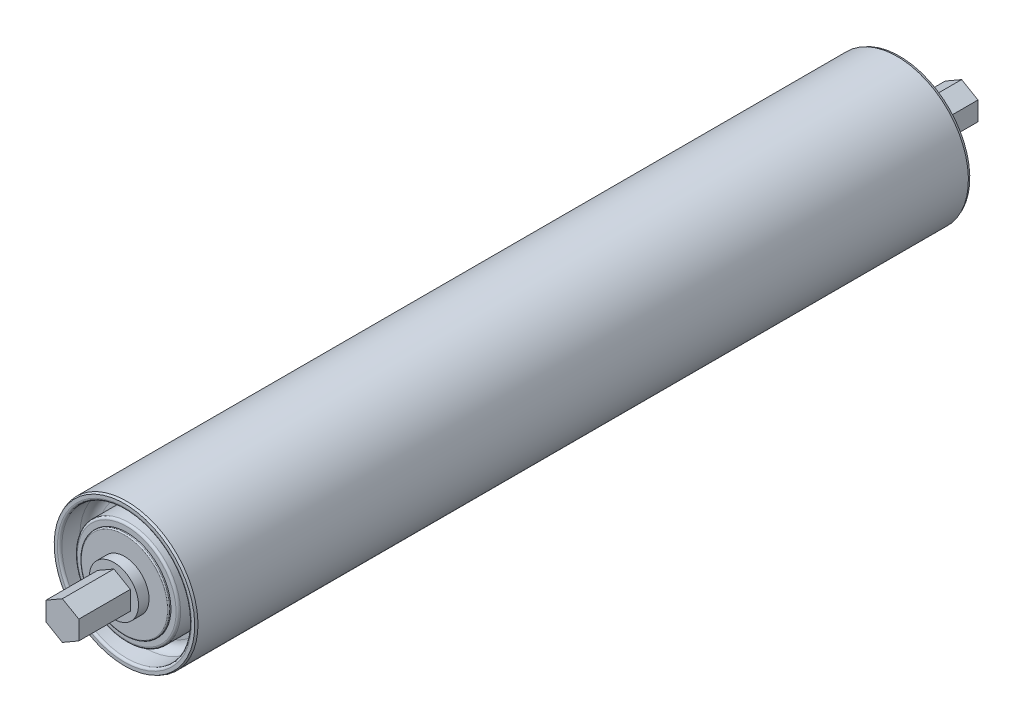
ISO-10303-21;
HEADER;
FILE_DESCRIPTION(('STEP AP214'),'2;1');
FILE_NAME('part.step','',(''),(''),'','','');
FILE_SCHEMA(('AUTOMOTIVE_DESIGN { 1 0 10303 214 1 1 1 1 }'));
ENDSEC;
DATA;
#1=APPLICATION_CONTEXT('core data for automotive mechanical design processes');
#2=APPLICATION_PROTOCOL_DEFINITION('international standard','automotive_design',2000,#1);
#3=PRODUCT_CONTEXT('',#1,'mechanical');
#4=PRODUCT('Part','Part','',(#3));
#5=PRODUCT_RELATED_PRODUCT_CATEGORY('part','',(#4));
#6=PRODUCT_DEFINITION_FORMATION('','',#4);
#7=PRODUCT_DEFINITION_CONTEXT('part definition',#1,'design');
#8=PRODUCT_DEFINITION('design','',#6,#7);
#9=PRODUCT_DEFINITION_SHAPE('','',#8);
#10=(LENGTH_UNIT() NAMED_UNIT(*) SI_UNIT(.MILLI.,.METRE.));
#11=(NAMED_UNIT(*) PLANE_ANGLE_UNIT() SI_UNIT($,.RADIAN.));
#12=(NAMED_UNIT(*) SI_UNIT($,.STERADIAN.) SOLID_ANGLE_UNIT());
#13=UNCERTAINTY_MEASURE_WITH_UNIT(LENGTH_MEASURE(1.E-05),#10,'distance_accuracy_value','');
#14=(GEOMETRIC_REPRESENTATION_CONTEXT(3) GLOBAL_UNCERTAINTY_ASSIGNED_CONTEXT((#13)) GLOBAL_UNIT_ASSIGNED_CONTEXT((#10,
#11,#12)) REPRESENTATION_CONTEXT('',''));
#15=CARTESIAN_POINT('',(0.,0.,0.));
#16=DIRECTION('',(0.,0.,1.));
#17=DIRECTION('',(1.,0.,0.));
#18=AXIS2_PLACEMENT_3D('',#15,#16,#17);
#19=CARTESIAN_POINT('',(0.,23.8125,-131.365625));
#20=DIRECTION('',(0.,0.,1.));
#21=DIRECTION('',(0.,-1.,0.));
#22=AXIS2_PLACEMENT_3D('',#19,#20,#21);
#23=PLANE('',#22);
#24=CARTESIAN_POINT('',(0.,0.,-131.365625));
#25=DIRECTION('',(0.,0.,1.));
#26=DIRECTION('',(0.,-1.,0.));
#27=AXIS2_PLACEMENT_3D('',#24,#25,#26);
#28=CIRCLE('',#27,22.733);
#29=CARTESIAN_POINT('',(0.,-22.733,-131.365625));
#30=VERTEX_POINT('',#29);
#31=EDGE_CURVE('E296',#30,#30,#28,.T.);
#32=ORIENTED_EDGE('',*,*,#31,.T.);
#33=EDGE_LOOP('',(#32));
#34=FACE_BOUND('',#33,.T.);
#35=CARTESIAN_POINT('',(0.,0.,-131.365625));
#36=DIRECTION('',(0.,0.,1.));
#37=DIRECTION('',(0.,-1.,0.));
#38=AXIS2_PLACEMENT_3D('',#35,#36,#37);
#39=CIRCLE('',#38,23.8125);
#40=CARTESIAN_POINT('',(0.,-23.8125,-131.365625));
#41=VERTEX_POINT('',#40);
#42=EDGE_CURVE('E214',#41,#41,#39,.T.);
#43=ORIENTED_EDGE('',*,*,#42,.F.);
#44=EDGE_LOOP('',(#43));
#45=FACE_BOUND('',#44,.T.);
#46=ADVANCED_FACE('F32',(#34,#45),#23,.F.);
#47=CARTESIAN_POINT('',(0.,0.,-131.365625));
#48=DIRECTION('',(0.,0.,1.));
#49=DIRECTION('',(0.,-1.,0.));
#50=AXIS2_PLACEMENT_3D('',#47,#48,#49);
#51=CONICAL_SURFACE('',#50,23.8125,0.380506377112347);
#52=CARTESIAN_POINT('',(0.,0.,-130.571875));
#53=DIRECTION('',(0.,0.,1.));
#54=DIRECTION('',(0.,-1.,0.));
#55=AXIS2_PLACEMENT_3D('',#52,#53,#54);
#56=CIRCLE('',#55,24.13);
#57=CARTESIAN_POINT('',(0.,-24.13,-130.571875));
#58=VERTEX_POINT('',#57);
#59=EDGE_CURVE('E211',#58,#58,#56,.T.);
#60=ORIENTED_EDGE('',*,*,#59,.F.);
#61=EDGE_LOOP('',(#60));
#62=FACE_BOUND('',#61,.T.);
#63=ORIENTED_EDGE('',*,*,#42,.T.);
#64=EDGE_LOOP('',(#63));
#65=FACE_BOUND('',#64,.T.);
#66=ADVANCED_FACE('F382',(#62,#65),#51,.T.);
#67=CARTESIAN_POINT('',(0.,0.,152.4));
#68=DIRECTION('',(0.,0.,1.));
#69=DIRECTION('',(0.,-1.,0.));
#70=AXIS2_PLACEMENT_3D('',#67,#68,#69);
#71=CYLINDRICAL_SURFACE('',#70,24.13);
#72=CARTESIAN_POINT('',(0.,0.,130.571875));
#73=DIRECTION('',(0.,0.,1.));
#74=DIRECTION('',(0.,-1.,0.));
#75=AXIS2_PLACEMENT_3D('',#72,#73,#74);
#76=CIRCLE('',#75,24.13);
#77=CARTESIAN_POINT('',(0.,-24.13,130.571875));
#78=VERTEX_POINT('',#77);
#79=EDGE_CURVE('E208',#78,#78,#76,.T.);
#80=ORIENTED_EDGE('',*,*,#79,.F.);
#81=EDGE_LOOP('',(#80));
#82=FACE_BOUND('',#81,.T.);
#83=ORIENTED_EDGE('',*,*,#59,.T.);
#84=EDGE_LOOP('',(#83));
#85=FACE_BOUND('',#84,.T.);
#86=ADVANCED_FACE('F387',(#82,#85),#71,.T.);
#87=CARTESIAN_POINT('',(0.,0.,130.571875));
#88=DIRECTION('',(0.,0.,-1.));
#89=DIRECTION('',(0.,1.,0.));
#90=AXIS2_PLACEMENT_3D('',#87,#88,#89);
#91=CONICAL_SURFACE('',#90,24.13,0.380506377112371);
#92=CARTESIAN_POINT('',(0.,0.,131.365625));
#93=DIRECTION('',(0.,0.,1.));
#94=DIRECTION('',(0.,-1.,0.));
#95=AXIS2_PLACEMENT_3D('',#92,#93,#94);
#96=CIRCLE('',#95,23.8125);
#97=CARTESIAN_POINT('',(0.,-23.8125,131.365625));
#98=VERTEX_POINT('',#97);
#99=EDGE_CURVE('E205',#98,#98,#96,.T.);
#100=ORIENTED_EDGE('',*,*,#99,.F.);
#101=EDGE_LOOP('',(#100));
#102=FACE_BOUND('',#101,.T.);
#103=ORIENTED_EDGE('',*,*,#79,.T.);
#104=EDGE_LOOP('',(#103));
#105=FACE_BOUND('',#104,.T.);
#106=ADVANCED_FACE('F466',(#102,#105),#91,.T.);
#107=CARTESIAN_POINT('',(0.,23.8125,131.365625));
#108=DIRECTION('',(0.,0.,-1.));
#109=DIRECTION('',(0.,1.,0.));
#110=AXIS2_PLACEMENT_3D('',#107,#108,#109);
#111=PLANE('',#110);
#112=CARTESIAN_POINT('',(0.,0.,131.365625));
#113=DIRECTION('',(0.,0.,1.));
#114=DIRECTION('',(0.,-1.,0.));
#115=AXIS2_PLACEMENT_3D('',#112,#113,#114);
#116=CIRCLE('',#115,22.733);
#117=CARTESIAN_POINT('',(0.,-22.733,131.365625));
#118=VERTEX_POINT('',#117);
#119=EDGE_CURVE('E131',#118,#118,#116,.T.);
#120=ORIENTED_EDGE('',*,*,#119,.F.);
#121=EDGE_LOOP('',(#120));
#122=FACE_BOUND('',#121,.T.);
#123=ORIENTED_EDGE('',*,*,#99,.T.);
#124=EDGE_LOOP('',(#123));
#125=FACE_BOUND('',#124,.T.);
#126=ADVANCED_FACE('F403',(#122,#125),#111,.F.);
#127=CARTESIAN_POINT('',(0.,0.,130.603625));
#128=DIRECTION('',(0.,0.,1.));
#129=DIRECTION('',(0.,-1.,0.));
#130=AXIS2_PLACEMENT_3D('',#127,#128,#129);
#131=TOROIDAL_SURFACE('',#130,22.733,0.762000000000009);
#132=ORIENTED_EDGE('',*,*,#119,.T.);
#133=EDGE_LOOP('',(#132));
#134=FACE_BOUND('',#133,.T.);
#135=CARTESIAN_POINT('',(0.,0.,130.603625));
#136=DIRECTION('',(0.,0.,1.));
#137=DIRECTION('',(0.,-1.,0.));
#138=AXIS2_PLACEMENT_3D('',#135,#136,#137);
#139=CIRCLE('',#138,21.971);
#140=CARTESIAN_POINT('',(0.,-21.971,130.603625));
#141=VERTEX_POINT('',#140);
#142=EDGE_CURVE('E293',#141,#141,#139,.T.);
#143=ORIENTED_EDGE('',*,*,#142,.F.);
#144=EDGE_LOOP('',(#143));
#145=FACE_BOUND('',#144,.T.);
#146=ADVANCED_FACE('F436',(#134,#145),#131,.T.);
#147=CARTESIAN_POINT('',(0.,0.,130.984625));
#148=DIRECTION('',(0.,0.,1.));
#149=DIRECTION('',(0.,-1.,0.));
#150=AXIS2_PLACEMENT_3D('',#147,#148,#149);
#151=TOROIDAL_SURFACE('',#150,14.620875,0.380999999999994);
#152=CARTESIAN_POINT('',(0.,0.,130.984625));
#153=DIRECTION('',(0.,0.,1.));
#154=DIRECTION('',(0.,-1.,0.));
#155=AXIS2_PLACEMENT_3D('',#152,#153,#154);
#156=CIRCLE('',#155,15.001875);
#157=CARTESIAN_POINT('',(0.,-15.001875,130.984625));
#158=VERTEX_POINT('',#157);
#159=EDGE_CURVE('E272',#158,#158,#156,.T.);
#160=ORIENTED_EDGE('',*,*,#159,.T.);
#161=EDGE_LOOP('',(#160));
#162=FACE_BOUND('',#161,.T.);
#163=CARTESIAN_POINT('',(0.,0.,131.365625));
#164=DIRECTION('',(0.,0.,1.));
#165=DIRECTION('',(0.,-1.,0.));
#166=AXIS2_PLACEMENT_3D('',#163,#164,#165);
#167=CIRCLE('',#166,14.620875);
#168=CARTESIAN_POINT('',(0.,-14.620875,131.365625));
#169=VERTEX_POINT('',#168);
#170=EDGE_CURVE('E269',#169,#169,#167,.T.);
#171=ORIENTED_EDGE('',*,*,#170,.F.);
#172=EDGE_LOOP('',(#171));
#173=FACE_BOUND('',#172,.T.);
#174=ADVANCED_FACE('F432',(#162,#173),#151,.T.);
#175=CARTESIAN_POINT('',(0.,0.,152.4));
#176=DIRECTION('',(0.,0.,1.));
#177=DIRECTION('',(0.,-1.,0.));
#178=AXIS2_PLACEMENT_3D('',#175,#176,#177);
#179=CYLINDRICAL_SURFACE('',#178,15.001875);
#180=CARTESIAN_POINT('',(0.,0.,130.603625));
#181=DIRECTION('',(0.,0.,1.));
#182=DIRECTION('',(0.,-1.,0.));
#183=AXIS2_PLACEMENT_3D('',#180,#181,#182);
#184=CIRCLE('',#183,15.001875);
#185=CARTESIAN_POINT('',(0.,-15.001875,130.603625));
#186=VERTEX_POINT('',#185);
#187=EDGE_CURVE('E275',#186,#186,#184,.T.);
#188=ORIENTED_EDGE('',*,*,#187,.T.);
#189=EDGE_LOOP('',(#188));
#190=FACE_BOUND('',#189,.T.);
#191=ORIENTED_EDGE('',*,*,#159,.F.);
#192=EDGE_LOOP('',(#191));
#193=FACE_BOUND('',#192,.T.);
#194=ADVANCED_FACE('F428',(#190,#193),#179,.T.);
#195=CARTESIAN_POINT('',(0.,15.001875,130.603625));
#196=DIRECTION('',(0.,0.,1.));
#197=DIRECTION('',(0.,-1.,0.));
#198=AXIS2_PLACEMENT_3D('',#195,#196,#197);
#199=PLANE('',#198);
#200=CARTESIAN_POINT('',(0.,0.,130.603625));
#201=DIRECTION('',(0.,0.,1.));
#202=DIRECTION('',(0.,-1.,0.));
#203=AXIS2_PLACEMENT_3D('',#200,#201,#202);
#204=CIRCLE('',#203,16.7401875);
#205=CARTESIAN_POINT('',(0.,-16.7401875,130.603625));
#206=VERTEX_POINT('',#205);
#207=EDGE_CURVE('E278',#206,#206,#204,.T.);
#208=ORIENTED_EDGE('',*,*,#207,.T.);
#209=EDGE_LOOP('',(#208));
#210=FACE_BOUND('',#209,.T.);
#211=ORIENTED_EDGE('',*,*,#187,.F.);
#212=EDGE_LOOP('',(#211));
#213=FACE_BOUND('',#212,.T.);
#214=ADVANCED_FACE('F424',(#210,#213),#199,.T.);
#215=CARTESIAN_POINT('',(0.,0.,129.841625));
#216=DIRECTION('',(0.,0.,1.));
#217=DIRECTION('',(0.,-1.,0.));
#218=AXIS2_PLACEMENT_3D('',#215,#216,#217);
#219=TOROIDAL_SURFACE('',#218,16.7401875,0.762000000000018);
#220=CARTESIAN_POINT('',(0.,0.,129.841625));
#221=DIRECTION('',(0.,0.,1.));
#222=DIRECTION('',(0.,-1.,0.));
#223=AXIS2_PLACEMENT_3D('',#220,#221,#222);
#224=CIRCLE('',#223,17.5021875);
#225=CARTESIAN_POINT('',(0.,-17.5021875,129.841625));
#226=VERTEX_POINT('',#225);
#227=EDGE_CURVE('E281',#226,#226,#224,.T.);
#228=ORIENTED_EDGE('',*,*,#227,.T.);
#229=EDGE_LOOP('',(#228));
#230=FACE_BOUND('',#229,.T.);
#231=ORIENTED_EDGE('',*,*,#207,.F.);
#232=EDGE_LOOP('',(#231));
#233=FACE_BOUND('',#232,.T.);
#234=ADVANCED_FACE('F420',(#230,#233),#219,.T.);
#235=CARTESIAN_POINT('',(0.,0.,152.4));
#236=DIRECTION('',(0.,0.,1.));
#237=DIRECTION('',(0.,-1.,0.));
#238=AXIS2_PLACEMENT_3D('',#235,#236,#237);
#239=CYLINDRICAL_SURFACE('',#238,17.5021875);
#240=CARTESIAN_POINT('',(0.,0.,121.44375));
#241=DIRECTION('',(0.,0.,1.));
#242=DIRECTION('',(0.,-1.,0.));
#243=AXIS2_PLACEMENT_3D('',#240,#241,#242);
#244=CIRCLE('',#243,17.5021875);
#245=CARTESIAN_POINT('',(0.,-17.5021875,121.44375));
#246=VERTEX_POINT('',#245);
#247=EDGE_CURVE('E284',#246,#246,#244,.T.);
#248=ORIENTED_EDGE('',*,*,#247,.T.);
#249=EDGE_LOOP('',(#248));
#250=FACE_BOUND('',#249,.T.);
#251=ORIENTED_EDGE('',*,*,#227,.F.);
#252=EDGE_LOOP('',(#251));
#253=FACE_BOUND('',#252,.T.);
#254=ADVANCED_FACE('F416',(#250,#253),#239,.T.);
#255=CARTESIAN_POINT('',(0.,17.5021875,121.44375));
#256=DIRECTION('',(0.,0.,1.));
#257=DIRECTION('',(0.,-1.,0.));
#258=AXIS2_PLACEMENT_3D('',#255,#256,#257);
#259=PLANE('',#258);
#260=CARTESIAN_POINT('',(0.,0.,121.44375));
#261=DIRECTION('',(0.,0.,1.));
#262=DIRECTION('',(0.,-1.,0.));
#263=AXIS2_PLACEMENT_3D('',#260,#261,#262);
#264=CIRCLE('',#263,18.923);
#265=CARTESIAN_POINT('',(0.,-18.923,121.44375));
#266=VERTEX_POINT('',#265);
#267=EDGE_CURVE('E287',#266,#266,#264,.T.);
#268=ORIENTED_EDGE('',*,*,#267,.T.);
#269=EDGE_LOOP('',(#268));
#270=FACE_BOUND('',#269,.T.);
#271=ORIENTED_EDGE('',*,*,#247,.F.);
#272=EDGE_LOOP('',(#271));
#273=FACE_BOUND('',#272,.T.);
#274=ADVANCED_FACE('F412',(#270,#273),#259,.T.);
#275=CARTESIAN_POINT('',(0.,0.,124.49175));
#276=DIRECTION('',(0.,0.,1.));
#277=DIRECTION('',(0.,-1.,0.));
#278=AXIS2_PLACEMENT_3D('',#275,#276,#277);
#279=TOROIDAL_SURFACE('',#278,18.923,3.048);
#280=CARTESIAN_POINT('',(0.,0.,124.49175));
#281=DIRECTION('',(0.,0.,1.));
#282=DIRECTION('',(0.,-1.,0.));
#283=AXIS2_PLACEMENT_3D('',#280,#281,#282);
#284=CIRCLE('',#283,21.971);
#285=CARTESIAN_POINT('',(0.,-21.971,124.49175));
#286=VERTEX_POINT('',#285);
#287=EDGE_CURVE('E290',#286,#286,#284,.T.);
#288=ORIENTED_EDGE('',*,*,#287,.T.);
#289=EDGE_LOOP('',(#288));
#290=FACE_BOUND('',#289,.T.);
#291=ORIENTED_EDGE('',*,*,#267,.F.);
#292=EDGE_LOOP('',(#291));
#293=FACE_BOUND('',#292,.T.);
#294=ADVANCED_FACE('F408',(#290,#293),#279,.F.);
#295=CARTESIAN_POINT('',(0.,0.,152.4));
#296=DIRECTION('',(0.,0.,1.));
#297=DIRECTION('',(0.,-1.,0.));
#298=AXIS2_PLACEMENT_3D('',#295,#296,#297);
#299=CYLINDRICAL_SURFACE('',#298,21.971);
#300=ORIENTED_EDGE('',*,*,#142,.T.);
#301=EDGE_LOOP('',(#300));
#302=FACE_BOUND('',#301,.T.);
#303=ORIENTED_EDGE('',*,*,#287,.F.);
#304=EDGE_LOOP('',(#303));
#305=FACE_BOUND('',#304,.T.);
#306=ADVANCED_FACE('F405',(#302,#305),#299,.F.);
#307=CARTESIAN_POINT('',(0.,0.,152.4));
#308=DIRECTION('',(0.,0.,-1.));
#309=DIRECTION('',(0.,1.,0.));
#310=AXIS2_PLACEMENT_3D('',#307,#308,#309);
#311=PLANE('',#310);
#312=DIRECTION('',(0.866025403784439,0.5,0.));
#313=VECTOR('',#312,1.);
#314=CARTESIAN_POINT('',(0.,-6.41580486636974,152.4));
#315=LINE('',#314,#313);
#316=CARTESIAN_POINT('',(0.,-6.41580486636974,152.4));
#317=VERTEX_POINT('',#316);
#318=CARTESIAN_POINT('',(5.55625,-3.20790243318488,152.4));
#319=VERTEX_POINT('',#318);
#320=EDGE_CURVE('E151',#317,#319,#315,.T.);
#321=ORIENTED_EDGE('',*,*,#320,.T.);
#322=DIRECTION('',(0.,1.,0.));
#323=VECTOR('',#322,1.);
#324=CARTESIAN_POINT('',(5.55625,-3.20790243318488,152.4));
#325=LINE('',#324,#323);
#326=CARTESIAN_POINT('',(5.55625,3.20790243318484,152.4));
#327=VERTEX_POINT('',#326);
#328=EDGE_CURVE('E127',#319,#327,#325,.T.);
#329=ORIENTED_EDGE('',*,*,#328,.T.);
#330=DIRECTION('',(-0.866025403784439,0.5,0.));
#331=VECTOR('',#330,1.);
#332=CARTESIAN_POINT('',(5.55625,3.20790243318484,152.4));
#333=LINE('',#332,#331);
#334=CARTESIAN_POINT('',(0.,6.4158048663697,152.4));
#335=VERTEX_POINT('',#334);
#336=EDGE_CURVE('E120',#327,#335,#333,.T.);
#337=ORIENTED_EDGE('',*,*,#336,.T.);
#338=DIRECTION('',(-0.866025403784439,-0.5,0.));
#339=VECTOR('',#338,1.);
#340=CARTESIAN_POINT('',(0.,6.4158048663697,152.4));
#341=LINE('',#340,#339);
#342=CARTESIAN_POINT('',(-5.55625,3.20790243318484,152.4));
#343=VERTEX_POINT('',#342);
#344=EDGE_CURVE('E124',#335,#343,#341,.T.);
#345=ORIENTED_EDGE('',*,*,#344,.T.);
#346=DIRECTION('',(0.,-1.,0.));
#347=VECTOR('',#346,1.);
#348=CARTESIAN_POINT('',(-5.55625,3.20790243318484,152.4));
#349=LINE('',#348,#347);
#350=CARTESIAN_POINT('',(-5.55625,-3.20790243318488,152.4));
#351=VERTEX_POINT('',#350);
#352=EDGE_CURVE('E144',#343,#351,#349,.T.);
#353=ORIENTED_EDGE('',*,*,#352,.T.);
#354=DIRECTION('',(0.866025403784439,-0.5,0.));
#355=VECTOR('',#354,1.);
#356=CARTESIAN_POINT('',(-5.55625,-3.20790243318488,152.4));
#357=LINE('',#356,#355);
#358=EDGE_CURVE('E146',#351,#317,#357,.T.);
#359=ORIENTED_EDGE('',*,*,#358,.T.);
#360=EDGE_LOOP('',(#321,#329,#337,#345,#353,#359));
#361=FACE_BOUND('',#360,.T.);
#362=ADVANCED_FACE('F122',(#361),#311,.F.);
#363=CARTESIAN_POINT('',(-5.55625,3.20790243318484,-169.374624136732));
#364=DIRECTION('',(-1.,0.,0.));
#365=DIRECTION('',(0.,-1.,0.));
#366=AXIS2_PLACEMENT_3D('',#363,#364,#365);
#367=PLANE('',#366);
#368=DIRECTION('',(0.,1.,0.));
#369=VECTOR('',#368,1.);
#370=CARTESIAN_POINT('',(-5.55625,8.334375,134.9375));
#371=LINE('',#370,#369);
#372=CARTESIAN_POINT('',(-5.55625,-3.20790243318488,134.9375));
#373=VERTEX_POINT('',#372);
#374=CARTESIAN_POINT('',(-5.55625,3.20790243318484,134.9375));
#375=VERTEX_POINT('',#374);
#376=EDGE_CURVE('E180',#373,#375,#371,.T.);
#377=ORIENTED_EDGE('',*,*,#376,.F.);
#378=DIRECTION('',(0.,0.,1.));
#379=VECTOR('',#378,1.);
#380=CARTESIAN_POINT('',(-5.55625,-3.20790243318488,-169.374624136732));
#381=LINE('',#380,#379);
#382=EDGE_CURVE('E170',#373,#351,#381,.T.);
#383=ORIENTED_EDGE('',*,*,#382,.T.);
#384=ORIENTED_EDGE('',*,*,#352,.F.);
#385=DIRECTION('',(0.,0.,1.));
#386=VECTOR('',#385,1.);
#387=CARTESIAN_POINT('',(-5.55625,3.20790243318484,-169.374624136732));
#388=LINE('',#387,#386);
#389=EDGE_CURVE('E142',#375,#343,#388,.T.);
#390=ORIENTED_EDGE('',*,*,#389,.F.);
#391=EDGE_LOOP('',(#377,#383,#384,#390));
#392=FACE_BOUND('',#391,.T.);
#393=ADVANCED_FACE('F452',(#392),#367,.T.);
#394=CARTESIAN_POINT('',(-5.55625,-3.20790243318488,-169.374624136732));
#395=DIRECTION('',(-0.5,-0.866025403784439,0.));
#396=DIRECTION('',(0.866025403784439,-0.5,0.));
#397=AXIS2_PLACEMENT_3D('',#394,#395,#396);
#398=PLANE('',#397);
#399=DIRECTION('',(-0.866025403784439,0.5,0.));
#400=VECTOR('',#399,1.);
#401=CARTESIAN_POINT('',(-6.38701523733297,-2.7282598997773,134.9375));
#402=LINE('',#401,#400);
#403=CARTESIAN_POINT('',(0.,-6.41580486636974,134.9375));
#404=VERTEX_POINT('',#403);
#405=EDGE_CURVE('E184',#404,#373,#402,.T.);
#406=ORIENTED_EDGE('',*,*,#405,.F.);
#407=DIRECTION('',(0.,0.,1.));
#408=VECTOR('',#407,1.);
#409=CARTESIAN_POINT('',(0.,-6.41580486636974,-169.374624136732));
#410=LINE('',#409,#408);
#411=EDGE_CURVE('E166',#404,#317,#410,.T.);
#412=ORIENTED_EDGE('',*,*,#411,.T.);
#413=ORIENTED_EDGE('',*,*,#358,.F.);
#414=ORIENTED_EDGE('',*,*,#382,.F.);
#415=EDGE_LOOP('',(#406,#412,#413,#414));
#416=FACE_BOUND('',#415,.T.);
#417=ADVANCED_FACE('F449',(#416),#398,.T.);
#418=CARTESIAN_POINT('',(0.,-6.41580486636974,-169.374624136732));
#419=DIRECTION('',(0.5,-0.866025403784439,0.));
#420=DIRECTION('',(0.866025403784439,0.5,0.));
#421=AXIS2_PLACEMENT_3D('',#418,#419,#420);
#422=PLANE('',#421);
#423=DIRECTION('',(-0.866025403784439,-0.5,0.));
#424=VECTOR('',#423,1.);
#425=CARTESIAN_POINT('',(6.38701523733297,-2.7282598997773,134.9375));
#426=LINE('',#425,#424);
#427=CARTESIAN_POINT('',(5.55625,-3.20790243318488,134.9375));
#428=VERTEX_POINT('',#427);
#429=EDGE_CURVE('E188',#428,#404,#426,.T.);
#430=ORIENTED_EDGE('',*,*,#429,.F.);
#431=DIRECTION('',(0.,0.,1.));
#432=VECTOR('',#431,1.);
#433=CARTESIAN_POINT('',(5.55625,-3.20790243318488,-169.374624136732));
#434=LINE('',#433,#432);
#435=EDGE_CURVE('E162',#428,#319,#434,.T.);
#436=ORIENTED_EDGE('',*,*,#435,.T.);
#437=ORIENTED_EDGE('',*,*,#320,.F.);
#438=ORIENTED_EDGE('',*,*,#411,.F.);
#439=EDGE_LOOP('',(#430,#436,#437,#438));
#440=FACE_BOUND('',#439,.T.);
#441=ADVANCED_FACE('F446',(#440),#422,.T.);
#442=CARTESIAN_POINT('',(5.55625,-3.20790243318488,-169.374624136732));
#443=DIRECTION('',(1.,0.,0.));
#444=DIRECTION('',(0.,1.,0.));
#445=AXIS2_PLACEMENT_3D('',#442,#443,#444);
#446=PLANE('',#445);
#447=DIRECTION('',(0.,-1.,0.));
#448=VECTOR('',#447,1.);
#449=CARTESIAN_POINT('',(5.55624999999999,8.334375,134.9375));
#450=LINE('',#449,#448);
#451=CARTESIAN_POINT('',(5.55625,3.20790243318484,134.9375));
#452=VERTEX_POINT('',#451);
#453=EDGE_CURVE('E192',#452,#428,#450,.T.);
#454=ORIENTED_EDGE('',*,*,#453,.F.);
#455=DIRECTION('',(0.,0.,1.));
#456=VECTOR('',#455,1.);
#457=CARTESIAN_POINT('',(5.55625,3.20790243318484,-169.374624136732));
#458=LINE('',#457,#456);
#459=EDGE_CURVE('E158',#452,#327,#458,.T.);
#460=ORIENTED_EDGE('',*,*,#459,.T.);
#461=ORIENTED_EDGE('',*,*,#328,.F.);
#462=ORIENTED_EDGE('',*,*,#435,.F.);
#463=EDGE_LOOP('',(#454,#460,#461,#462));
#464=FACE_BOUND('',#463,.T.);
#465=ADVANCED_FACE('F443',(#464),#446,.T.);
#466=CARTESIAN_POINT('',(5.55625,3.20790243318484,-169.374624136732));
#467=DIRECTION('',(0.5,0.866025403784439,0.));
#468=DIRECTION('',(-0.866025403784439,0.5,0.));
#469=AXIS2_PLACEMENT_3D('',#466,#467,#468);
#470=PLANE('',#469);
#471=DIRECTION('',(0.866025403784439,-0.5,0.));
#472=VECTOR('',#471,1.);
#473=CARTESIAN_POINT('',(-0.830765237332974,6.89544739977727,134.9375));
#474=LINE('',#473,#472);
#475=CARTESIAN_POINT('',(0.,6.4158048663697,134.9375));
#476=VERTEX_POINT('',#475);
#477=EDGE_CURVE('E136',#476,#452,#474,.T.);
#478=ORIENTED_EDGE('',*,*,#477,.F.);
#479=DIRECTION('',(0.,0.,1.));
#480=VECTOR('',#479,1.);
#481=CARTESIAN_POINT('',(0.,6.4158048663697,-169.374624136732));
#482=LINE('',#481,#480);
#483=EDGE_CURVE('E134',#476,#335,#482,.T.);
#484=ORIENTED_EDGE('',*,*,#483,.T.);
#485=ORIENTED_EDGE('',*,*,#336,.F.);
#486=ORIENTED_EDGE('',*,*,#459,.F.);
#487=EDGE_LOOP('',(#478,#484,#485,#486));
#488=FACE_BOUND('',#487,.T.);
#489=ADVANCED_FACE('F135',(#488),#470,.T.);
#490=CARTESIAN_POINT('',(0.,6.4158048663697,-169.374624136732));
#491=DIRECTION('',(-0.5,0.866025403784439,0.));
#492=DIRECTION('',(-0.866025403784439,-0.5,0.));
#493=AXIS2_PLACEMENT_3D('',#490,#491,#492);
#494=PLANE('',#493);
#495=DIRECTION('',(0.866025403784439,0.5,0.));
#496=VECTOR('',#495,1.);
#497=CARTESIAN_POINT('',(0.830765237332974,6.89544739977727,134.9375));
#498=LINE('',#497,#496);
#499=EDGE_CURVE('E55',#375,#476,#498,.T.);
#500=ORIENTED_EDGE('',*,*,#499,.F.);
#501=ORIENTED_EDGE('',*,*,#389,.T.);
#502=ORIENTED_EDGE('',*,*,#344,.F.);
#503=ORIENTED_EDGE('',*,*,#483,.F.);
#504=EDGE_LOOP('',(#500,#501,#502,#503));
#505=FACE_BOUND('',#504,.T.);
#506=ADVANCED_FACE('F140',(#505),#494,.T.);
#507=CARTESIAN_POINT('',(0.,8.334375,134.9375));
#508=DIRECTION('',(0.,0.,-1.));
#509=DIRECTION('',(0.,1.,0.));
#510=AXIS2_PLACEMENT_3D('',#507,#508,#509);
#511=PLANE('',#510);
#512=ORIENTED_EDGE('',*,*,#499,.T.);
#513=ORIENTED_EDGE('',*,*,#477,.T.);
#514=ORIENTED_EDGE('',*,*,#453,.T.);
#515=ORIENTED_EDGE('',*,*,#429,.T.);
#516=ORIENTED_EDGE('',*,*,#405,.T.);
#517=ORIENTED_EDGE('',*,*,#376,.T.);
#518=EDGE_LOOP('',(#512,#513,#514,#515,#516,#517));
#519=FACE_BOUND('',#518,.T.);
#520=CARTESIAN_POINT('',(0.,0.,134.9375));
#521=DIRECTION('',(0.,0.,1.));
#522=DIRECTION('',(0.,-1.,0.));
#523=AXIS2_PLACEMENT_3D('',#520,#521,#522);
#524=CIRCLE('',#523,8.334375);
#525=CARTESIAN_POINT('',(0.,-8.334375,134.9375));
#526=VERTEX_POINT('',#525);
#527=EDGE_CURVE('E199',#526,#526,#524,.T.);
#528=ORIENTED_EDGE('',*,*,#527,.T.);
#529=EDGE_LOOP('',(#528));
#530=FACE_BOUND('',#529,.T.);
#531=ADVANCED_FACE('F459',(#519,#530),#511,.F.);
#532=CARTESIAN_POINT('',(0.,0.,152.4));
#533=DIRECTION('',(0.,0.,1.));
#534=DIRECTION('',(0.,-1.,0.));
#535=AXIS2_PLACEMENT_3D('',#532,#533,#534);
#536=CYLINDRICAL_SURFACE('',#535,8.334375);
#537=ORIENTED_EDGE('',*,*,#527,.F.);
#538=EDGE_LOOP('',(#537));
#539=FACE_BOUND('',#538,.T.);
#540=CARTESIAN_POINT('',(0.,0.,131.365625));
#541=DIRECTION('',(0.,0.,1.));
#542=DIRECTION('',(0.,-1.,0.));
#543=AXIS2_PLACEMENT_3D('',#540,#541,#542);
#544=CIRCLE('',#543,8.334375);
#545=CARTESIAN_POINT('',(0.,-8.334375,131.365625));
#546=VERTEX_POINT('',#545);
#547=EDGE_CURVE('E202',#546,#546,#544,.T.);
#548=ORIENTED_EDGE('',*,*,#547,.T.);
#549=EDGE_LOOP('',(#548));
#550=FACE_BOUND('',#549,.T.);
#551=ADVANCED_FACE('F400',(#539,#550),#536,.T.);
#552=ORIENTED_EDGE('',*,*,#547,.F.);
#553=EDGE_LOOP('',(#552));
#554=FACE_BOUND('',#553,.T.);
#555=ORIENTED_EDGE('',*,*,#170,.T.);
#556=EDGE_LOOP('',(#555));
#557=FACE_BOUND('',#556,.T.);
#558=ADVANCED_FACE('F395',(#554,#557),#111,.F.);
#559=CARTESIAN_POINT('',(0.,0.,-130.603625));
#560=DIRECTION('',(0.,0.,-1.));
#561=DIRECTION('',(0.,-1.,0.));
#562=AXIS2_PLACEMENT_3D('',#559,#560,#561);
#563=TOROIDAL_SURFACE('',#562,22.733,0.762000000000009);
#564=ORIENTED_EDGE('',*,*,#31,.F.);
#565=EDGE_LOOP('',(#564));
#566=FACE_BOUND('',#565,.T.);
#567=CARTESIAN_POINT('',(0.,0.,-130.603625));
#568=DIRECTION('',(0.,0.,1.));
#569=DIRECTION('',(0.,-1.,0.));
#570=AXIS2_PLACEMENT_3D('',#567,#568,#569);
#571=CIRCLE('',#570,21.971);
#572=CARTESIAN_POINT('',(0.,-21.971,-130.603625));
#573=VERTEX_POINT('',#572);
#574=EDGE_CURVE('E323',#573,#573,#571,.T.);
#575=ORIENTED_EDGE('',*,*,#574,.T.);
#576=EDGE_LOOP('',(#575));
#577=FACE_BOUND('',#576,.T.);
#578=ADVANCED_FACE('F327',(#566,#577),#563,.T.);
#579=CARTESIAN_POINT('',(0.,0.,-130.984625));
#580=DIRECTION('',(0.,0.,-1.));
#581=DIRECTION('',(0.,-1.,0.));
#582=AXIS2_PLACEMENT_3D('',#579,#580,#581);
#583=TOROIDAL_SURFACE('',#582,14.620875,0.380999999999994);
#584=CARTESIAN_POINT('',(0.,0.,-130.984625));
#585=DIRECTION('',(0.,0.,1.));
#586=DIRECTION('',(0.,-1.,0.));
#587=AXIS2_PLACEMENT_3D('',#584,#585,#586);
#588=CIRCLE('',#587,15.001875);
#589=CARTESIAN_POINT('',(0.,-15.001875,-130.984625));
#590=VERTEX_POINT('',#589);
#591=EDGE_CURVE('E302',#590,#590,#588,.T.);
#592=ORIENTED_EDGE('',*,*,#591,.F.);
#593=EDGE_LOOP('',(#592));
#594=FACE_BOUND('',#593,.T.);
#595=CARTESIAN_POINT('',(0.,0.,-131.365625));
#596=DIRECTION('',(0.,0.,1.));
#597=DIRECTION('',(0.,-1.,0.));
#598=AXIS2_PLACEMENT_3D('',#595,#596,#597);
#599=CIRCLE('',#598,14.620875);
#600=CARTESIAN_POINT('',(0.,-14.620875,-131.365625));
#601=VERTEX_POINT('',#600);
#602=EDGE_CURVE('E299',#601,#601,#599,.T.);
#603=ORIENTED_EDGE('',*,*,#602,.T.);
#604=EDGE_LOOP('',(#603));
#605=FACE_BOUND('',#604,.T.);
#606=ADVANCED_FACE('F368',(#594,#605),#583,.T.);
#607=CARTESIAN_POINT('',(0.,0.,-152.4));
#608=DIRECTION('',(0.,0.,-1.));
#609=DIRECTION('',(0.,-1.,0.));
#610=AXIS2_PLACEMENT_3D('',#607,#608,#609);
#611=CYLINDRICAL_SURFACE('',#610,15.001875);
#612=CARTESIAN_POINT('',(0.,0.,-130.603625));
#613=DIRECTION('',(0.,0.,1.));
#614=DIRECTION('',(0.,-1.,0.));
#615=AXIS2_PLACEMENT_3D('',#612,#613,#614);
#616=CIRCLE('',#615,15.001875);
#617=CARTESIAN_POINT('',(0.,-15.001875,-130.603625));
#618=VERTEX_POINT('',#617);
#619=EDGE_CURVE('E305',#618,#618,#616,.T.);
#620=ORIENTED_EDGE('',*,*,#619,.F.);
#621=EDGE_LOOP('',(#620));
#622=FACE_BOUND('',#621,.T.);
#623=ORIENTED_EDGE('',*,*,#591,.T.);
#624=EDGE_LOOP('',(#623));
#625=FACE_BOUND('',#624,.T.);
#626=ADVANCED_FACE('F362',(#622,#625),#611,.T.);
#627=CARTESIAN_POINT('',(0.,15.001875,-130.603625));
#628=DIRECTION('',(0.,0.,-1.));
#629=DIRECTION('',(0.,-1.,0.));
#630=AXIS2_PLACEMENT_3D('',#627,#628,#629);
#631=PLANE('',#630);
#632=CARTESIAN_POINT('',(0.,0.,-130.603625));
#633=DIRECTION('',(0.,0.,1.));
#634=DIRECTION('',(0.,-1.,0.));
#635=AXIS2_PLACEMENT_3D('',#632,#633,#634);
#636=CIRCLE('',#635,16.7401875);
#637=CARTESIAN_POINT('',(0.,-16.7401875,-130.603625));
#638=VERTEX_POINT('',#637);
#639=EDGE_CURVE('E308',#638,#638,#636,.T.);
#640=ORIENTED_EDGE('',*,*,#639,.F.);
#641=EDGE_LOOP('',(#640));
#642=FACE_BOUND('',#641,.T.);
#643=ORIENTED_EDGE('',*,*,#619,.T.);
#644=EDGE_LOOP('',(#643));
#645=FACE_BOUND('',#644,.T.);
#646=ADVANCED_FACE('F356',(#642,#645),#631,.T.);
#647=CARTESIAN_POINT('',(0.,0.,-129.841625));
#648=DIRECTION('',(0.,0.,-1.));
#649=DIRECTION('',(0.,-1.,0.));
#650=AXIS2_PLACEMENT_3D('',#647,#648,#649);
#651=TOROIDAL_SURFACE('',#650,16.7401875,0.762000000000018);
#652=CARTESIAN_POINT('',(0.,0.,-129.841625));
#653=DIRECTION('',(0.,0.,1.));
#654=DIRECTION('',(0.,-1.,0.));
#655=AXIS2_PLACEMENT_3D('',#652,#653,#654);
#656=CIRCLE('',#655,17.5021875);
#657=CARTESIAN_POINT('',(0.,-17.5021875,-129.841625));
#658=VERTEX_POINT('',#657);
#659=EDGE_CURVE('E311',#658,#658,#656,.T.);
#660=ORIENTED_EDGE('',*,*,#659,.F.);
#661=EDGE_LOOP('',(#660));
#662=FACE_BOUND('',#661,.T.);
#663=ORIENTED_EDGE('',*,*,#639,.T.);
#664=EDGE_LOOP('',(#663));
#665=FACE_BOUND('',#664,.T.);
#666=ADVANCED_FACE('F350',(#662,#665),#651,.T.);
#667=CARTESIAN_POINT('',(0.,0.,-152.4));
#668=DIRECTION('',(0.,0.,-1.));
#669=DIRECTION('',(0.,-1.,0.));
#670=AXIS2_PLACEMENT_3D('',#667,#668,#669);
#671=CYLINDRICAL_SURFACE('',#670,17.5021875);
#672=CARTESIAN_POINT('',(0.,0.,-121.44375));
#673=DIRECTION('',(0.,0.,1.));
#674=DIRECTION('',(0.,-1.,0.));
#675=AXIS2_PLACEMENT_3D('',#672,#673,#674);
#676=CIRCLE('',#675,17.5021875);
#677=CARTESIAN_POINT('',(0.,-17.5021875,-121.44375));
#678=VERTEX_POINT('',#677);
#679=EDGE_CURVE('E314',#678,#678,#676,.T.);
#680=ORIENTED_EDGE('',*,*,#679,.F.);
#681=EDGE_LOOP('',(#680));
#682=FACE_BOUND('',#681,.T.);
#683=ORIENTED_EDGE('',*,*,#659,.T.);
#684=EDGE_LOOP('',(#683));
#685=FACE_BOUND('',#684,.T.);
#686=ADVANCED_FACE('F344',(#682,#685),#671,.T.);
#687=CARTESIAN_POINT('',(0.,17.5021875,-121.44375));
#688=DIRECTION('',(0.,0.,-1.));
#689=DIRECTION('',(0.,-1.,0.));
#690=AXIS2_PLACEMENT_3D('',#687,#688,#689);
#691=PLANE('',#690);
#692=CARTESIAN_POINT('',(0.,0.,-121.44375));
#693=DIRECTION('',(0.,0.,1.));
#694=DIRECTION('',(0.,-1.,0.));
#695=AXIS2_PLACEMENT_3D('',#692,#693,#694);
#696=CIRCLE('',#695,18.923);
#697=CARTESIAN_POINT('',(0.,-18.923,-121.44375));
#698=VERTEX_POINT('',#697);
#699=EDGE_CURVE('E317',#698,#698,#696,.T.);
#700=ORIENTED_EDGE('',*,*,#699,.F.);
#701=EDGE_LOOP('',(#700));
#702=FACE_BOUND('',#701,.T.);
#703=ORIENTED_EDGE('',*,*,#679,.T.);
#704=EDGE_LOOP('',(#703));
#705=FACE_BOUND('',#704,.T.);
#706=ADVANCED_FACE('F338',(#702,#705),#691,.T.);
#707=CARTESIAN_POINT('',(0.,0.,-124.49175));
#708=DIRECTION('',(0.,0.,-1.));
#709=DIRECTION('',(0.,-1.,0.));
#710=AXIS2_PLACEMENT_3D('',#707,#708,#709);
#711=TOROIDAL_SURFACE('',#710,18.923,3.048);
#712=CARTESIAN_POINT('',(0.,0.,-124.49175));
#713=DIRECTION('',(0.,0.,1.));
#714=DIRECTION('',(0.,-1.,0.));
#715=AXIS2_PLACEMENT_3D('',#712,#713,#714);
#716=CIRCLE('',#715,21.971);
#717=CARTESIAN_POINT('',(0.,-21.971,-124.49175));
#718=VERTEX_POINT('',#717);
#719=EDGE_CURVE('E320',#718,#718,#716,.T.);
#720=ORIENTED_EDGE('',*,*,#719,.F.);
#721=EDGE_LOOP('',(#720));
#722=FACE_BOUND('',#721,.T.);
#723=ORIENTED_EDGE('',*,*,#699,.T.);
#724=EDGE_LOOP('',(#723));
#725=FACE_BOUND('',#724,.T.);
#726=ADVANCED_FACE('F332',(#722,#725),#711,.F.);
#727=CARTESIAN_POINT('',(0.,0.,-152.4));
#728=DIRECTION('',(0.,0.,-1.));
#729=DIRECTION('',(0.,-1.,0.));
#730=AXIS2_PLACEMENT_3D('',#727,#728,#729);
#731=CYLINDRICAL_SURFACE('',#730,21.971);
#732=ORIENTED_EDGE('',*,*,#574,.F.);
#733=EDGE_LOOP('',(#732));
#734=FACE_BOUND('',#733,.T.);
#735=ORIENTED_EDGE('',*,*,#719,.T.);
#736=EDGE_LOOP('',(#735));
#737=FACE_BOUND('',#736,.T.);
#738=ADVANCED_FACE('F329',(#734,#737),#731,.F.);
#739=CARTESIAN_POINT('',(0.,0.,-152.4));
#740=DIRECTION('',(0.,0.,1.));
#741=DIRECTION('',(0.,-1.,0.));
#742=AXIS2_PLACEMENT_3D('',#739,#740,#741);
#743=PLANE('',#742);
#744=DIRECTION('',(0.866025403784439,-0.5,0.));
#745=VECTOR('',#744,1.);
#746=CARTESIAN_POINT('',(5.55625,3.20790243318484,-152.4));
#747=LINE('',#746,#745);
#748=CARTESIAN_POINT('',(0.,6.4158048663697,-152.4));
#749=VERTEX_POINT('',#748);
#750=CARTESIAN_POINT('',(5.55625,3.20790243318484,-152.4));
#751=VERTEX_POINT('',#750);
#752=EDGE_CURVE('E177',#749,#751,#747,.T.);
#753=ORIENTED_EDGE('',*,*,#752,.T.);
#754=DIRECTION('',(0.,-1.,0.));
#755=VECTOR('',#754,1.);
#756=CARTESIAN_POINT('',(5.55625,-3.20790243318488,-152.4));
#757=LINE('',#756,#755);
#758=CARTESIAN_POINT('',(5.55625,-3.20790243318488,-152.4));
#759=VERTEX_POINT('',#758);
#760=EDGE_CURVE('E250',#751,#759,#757,.T.);
#761=ORIENTED_EDGE('',*,*,#760,.T.);
#762=DIRECTION('',(-0.866025403784439,-0.5,0.));
#763=VECTOR('',#762,1.);
#764=CARTESIAN_POINT('',(0.,-6.41580486636974,-152.4));
#765=LINE('',#764,#763);
#766=CARTESIAN_POINT('',(0.,-6.41580486636974,-152.4));
#767=VERTEX_POINT('',#766);
#768=EDGE_CURVE('E247',#759,#767,#765,.T.);
#769=ORIENTED_EDGE('',*,*,#768,.T.);
#770=DIRECTION('',(-0.866025403784439,0.5,0.));
#771=VECTOR('',#770,1.);
#772=CARTESIAN_POINT('',(-5.55625,-3.20790243318488,-152.4));
#773=LINE('',#772,#771);
#774=CARTESIAN_POINT('',(-5.55625,-3.20790243318488,-152.4));
#775=VERTEX_POINT('',#774);
#776=EDGE_CURVE('E243',#767,#775,#773,.T.);
#777=ORIENTED_EDGE('',*,*,#776,.T.);
#778=DIRECTION('',(0.,1.,0.));
#779=VECTOR('',#778,1.);
#780=CARTESIAN_POINT('',(-5.55625,3.20790243318484,-152.4));
#781=LINE('',#780,#779);
#782=CARTESIAN_POINT('',(-5.55625,3.20790243318484,-152.4));
#783=VERTEX_POINT('',#782);
#784=EDGE_CURVE('E157',#775,#783,#781,.T.);
#785=ORIENTED_EDGE('',*,*,#784,.T.);
#786=DIRECTION('',(0.866025403784439,0.5,0.));
#787=VECTOR('',#786,1.);
#788=CARTESIAN_POINT('',(0.,6.41580486636969,-152.4));
#789=LINE('',#788,#787);
#790=EDGE_CURVE('E174',#783,#749,#789,.T.);
#791=ORIENTED_EDGE('',*,*,#790,.T.);
#792=EDGE_LOOP('',(#753,#761,#769,#777,#785,#791));
#793=FACE_BOUND('',#792,.T.);
#794=ADVANCED_FACE('F34',(#793),#743,.F.);
#795=CARTESIAN_POINT('',(-5.55625,-3.20790243318488,-134.9375));
#796=VERTEX_POINT('',#795);
#797=EDGE_CURVE('E167',#775,#796,#381,.T.);
#798=ORIENTED_EDGE('',*,*,#797,.T.);
#799=DIRECTION('',(0.,-1.,0.));
#800=VECTOR('',#799,1.);
#801=CARTESIAN_POINT('',(-5.55625,8.33437500000003,-134.9375));
#802=LINE('',#801,#800);
#803=CARTESIAN_POINT('',(-5.55625,3.20790243318484,-134.9375));
#804=VERTEX_POINT('',#803);
#805=EDGE_CURVE('E182',#804,#796,#802,.T.);
#806=ORIENTED_EDGE('',*,*,#805,.F.);
#807=EDGE_CURVE('E171',#783,#804,#388,.T.);
#808=ORIENTED_EDGE('',*,*,#807,.F.);
#809=ORIENTED_EDGE('',*,*,#784,.F.);
#810=EDGE_LOOP('',(#798,#806,#808,#809));
#811=FACE_BOUND('',#810,.T.);
#812=ADVANCED_FACE('F265',(#811),#367,.T.);
#813=ORIENTED_EDGE('',*,*,#807,.T.);
#814=DIRECTION('',(-0.866025403784439,-0.5,0.));
#815=VECTOR('',#814,1.);
#816=CARTESIAN_POINT('',(0.830765237332988,6.89544739977728,-134.9375));
#817=LINE('',#816,#815);
#818=CARTESIAN_POINT('',(0.,6.4158048663697,-134.9375));
#819=VERTEX_POINT('',#818);
#820=EDGE_CURVE('E47',#819,#804,#817,.T.);
#821=ORIENTED_EDGE('',*,*,#820,.F.);
#822=EDGE_CURVE('E138',#749,#819,#482,.T.);
#823=ORIENTED_EDGE('',*,*,#822,.F.);
#824=ORIENTED_EDGE('',*,*,#790,.F.);
#825=EDGE_LOOP('',(#813,#821,#823,#824));
#826=FACE_BOUND('',#825,.T.);
#827=ADVANCED_FACE('F262',(#826),#494,.T.);
#828=ORIENTED_EDGE('',*,*,#822,.T.);
#829=DIRECTION('',(-0.866025403784439,0.5,0.));
#830=VECTOR('',#829,1.);
#831=CARTESIAN_POINT('',(-0.830765237332988,6.89544739977728,-134.9375));
#832=LINE('',#831,#830);
#833=CARTESIAN_POINT('',(5.55625,3.20790243318484,-134.9375));
#834=VERTEX_POINT('',#833);
#835=EDGE_CURVE('E197',#834,#819,#832,.T.);
#836=ORIENTED_EDGE('',*,*,#835,.F.);
#837=EDGE_CURVE('E154',#751,#834,#458,.T.);
#838=ORIENTED_EDGE('',*,*,#837,.F.);
#839=ORIENTED_EDGE('',*,*,#752,.F.);
#840=EDGE_LOOP('',(#828,#836,#838,#839));
#841=FACE_BOUND('',#840,.T.);
#842=ADVANCED_FACE('F258',(#841),#470,.T.);
#843=ORIENTED_EDGE('',*,*,#837,.T.);
#844=DIRECTION('',(0.,1.,0.));
#845=VECTOR('',#844,1.);
#846=CARTESIAN_POINT('',(5.55624999999999,8.33437500000004,-134.9375));
#847=LINE('',#846,#845);
#848=CARTESIAN_POINT('',(5.55625,-3.20790243318488,-134.9375));
#849=VERTEX_POINT('',#848);
#850=EDGE_CURVE('E194',#849,#834,#847,.T.);
#851=ORIENTED_EDGE('',*,*,#850,.F.);
#852=EDGE_CURVE('E159',#759,#849,#434,.T.);
#853=ORIENTED_EDGE('',*,*,#852,.F.);
#854=ORIENTED_EDGE('',*,*,#760,.F.);
#855=EDGE_LOOP('',(#843,#851,#853,#854));
#856=FACE_BOUND('',#855,.T.);
#857=ADVANCED_FACE('F260',(#856),#446,.T.);
#858=ORIENTED_EDGE('',*,*,#852,.T.);
#859=DIRECTION('',(0.866025403784439,0.5,0.));
#860=VECTOR('',#859,1.);
#861=CARTESIAN_POINT('',(6.38701523733299,-2.72825989977729,-134.9375));
#862=LINE('',#861,#860);
#863=CARTESIAN_POINT('',(0.,-6.41580486636974,-134.9375));
#864=VERTEX_POINT('',#863);
#865=EDGE_CURVE('E190',#864,#849,#862,.T.);
#866=ORIENTED_EDGE('',*,*,#865,.F.);
#867=EDGE_CURVE('E163',#767,#864,#410,.T.);
#868=ORIENTED_EDGE('',*,*,#867,.F.);
#869=ORIENTED_EDGE('',*,*,#768,.F.);
#870=EDGE_LOOP('',(#858,#866,#868,#869));
#871=FACE_BOUND('',#870,.T.);
#872=ADVANCED_FACE('F239',(#871),#422,.T.);
#873=ORIENTED_EDGE('',*,*,#867,.T.);
#874=DIRECTION('',(0.866025403784439,-0.5,0.));
#875=VECTOR('',#874,1.);
#876=CARTESIAN_POINT('',(-6.38701523733299,-2.72825989977729,-134.9375));
#877=LINE('',#876,#875);
#878=EDGE_CURVE('E186',#796,#864,#877,.T.);
#879=ORIENTED_EDGE('',*,*,#878,.F.);
#880=ORIENTED_EDGE('',*,*,#797,.F.);
#881=ORIENTED_EDGE('',*,*,#776,.F.);
#882=EDGE_LOOP('',(#873,#879,#880,#881));
#883=FACE_BOUND('',#882,.T.);
#884=ADVANCED_FACE('F230',(#883),#398,.T.);
#885=CARTESIAN_POINT('',(0.,8.33437500000003,-134.9375));
#886=DIRECTION('',(0.,0.,1.));
#887=DIRECTION('',(0.,-1.,0.));
#888=AXIS2_PLACEMENT_3D('',#885,#886,#887);
#889=PLANE('',#888);
#890=CARTESIAN_POINT('',(0.,0.,-134.9375));
#891=DIRECTION('',(0.,0.,1.));
#892=DIRECTION('',(0.,-1.,0.));
#893=AXIS2_PLACEMENT_3D('',#890,#891,#892);
#894=CIRCLE('',#893,8.334375);
#895=CARTESIAN_POINT('',(0.,-8.33437499999996,-134.9375));
#896=VERTEX_POINT('',#895);
#897=EDGE_CURVE('E11',#896,#896,#894,.T.);
#898=ORIENTED_EDGE('',*,*,#897,.F.);
#899=EDGE_LOOP('',(#898));
#900=FACE_BOUND('',#899,.T.);
#901=ORIENTED_EDGE('',*,*,#878,.T.);
#902=ORIENTED_EDGE('',*,*,#865,.T.);
#903=ORIENTED_EDGE('',*,*,#850,.T.);
#904=ORIENTED_EDGE('',*,*,#835,.T.);
#905=ORIENTED_EDGE('',*,*,#820,.T.);
#906=ORIENTED_EDGE('',*,*,#805,.T.);
#907=EDGE_LOOP('',(#901,#902,#903,#904,#905,#906));
#908=FACE_BOUND('',#907,.T.);
#909=ADVANCED_FACE('F225',(#900,#908),#889,.F.);
#910=CARTESIAN_POINT('',(0.,0.,152.4));
#911=DIRECTION('',(0.,0.,1.));
#912=DIRECTION('',(0.,-1.,0.));
#913=AXIS2_PLACEMENT_3D('',#910,#911,#912);
#914=CYLINDRICAL_SURFACE('',#913,8.334375);
#915=CARTESIAN_POINT('',(0.,0.,-131.365625));
#916=DIRECTION('',(0.,0.,1.));
#917=DIRECTION('',(0.,-1.,0.));
#918=AXIS2_PLACEMENT_3D('',#915,#916,#917);
#919=CIRCLE('',#918,8.334375);
#920=CARTESIAN_POINT('',(0.,-8.33437499999996,-131.365625));
#921=VERTEX_POINT('',#920);
#922=EDGE_CURVE('E40',#921,#921,#919,.T.);
#923=ORIENTED_EDGE('',*,*,#922,.F.);
#924=EDGE_LOOP('',(#923));
#925=FACE_BOUND('',#924,.T.);
#926=ORIENTED_EDGE('',*,*,#897,.T.);
#927=EDGE_LOOP('',(#926));
#928=FACE_BOUND('',#927,.T.);
#929=ADVANCED_FACE('F222',(#925,#928),#914,.T.);
#930=ORIENTED_EDGE('',*,*,#922,.T.);
#931=EDGE_LOOP('',(#930));
#932=FACE_BOUND('',#931,.T.);
#933=ORIENTED_EDGE('',*,*,#602,.F.);
#934=EDGE_LOOP('',(#933));
#935=FACE_BOUND('',#934,.T.);
#936=ADVANCED_FACE('F219',(#932,#935),#23,.F.);
#937=CLOSED_SHELL('',(#46,#66,#86,#106,#126,#146,#174,#194,#214,#234,#254,#274,#294,#306,#362,
#393,#417,#441,#465,#489,#506,#531,#551,#558,#578,#606,#626,#646,#666,#686,#706,#726,#738,#794,
#812,#827,#842,#857,#872,#884,#909,#929,#936));
#938=MANIFOLD_SOLID_BREP('B2',#937);
#939=ADVANCED_BREP_SHAPE_REPRESENTATION('',(#18,#938),#14);
#940=SHAPE_DEFINITION_REPRESENTATION(#9,#939);
ENDSEC;
END-ISO-10303-21;
